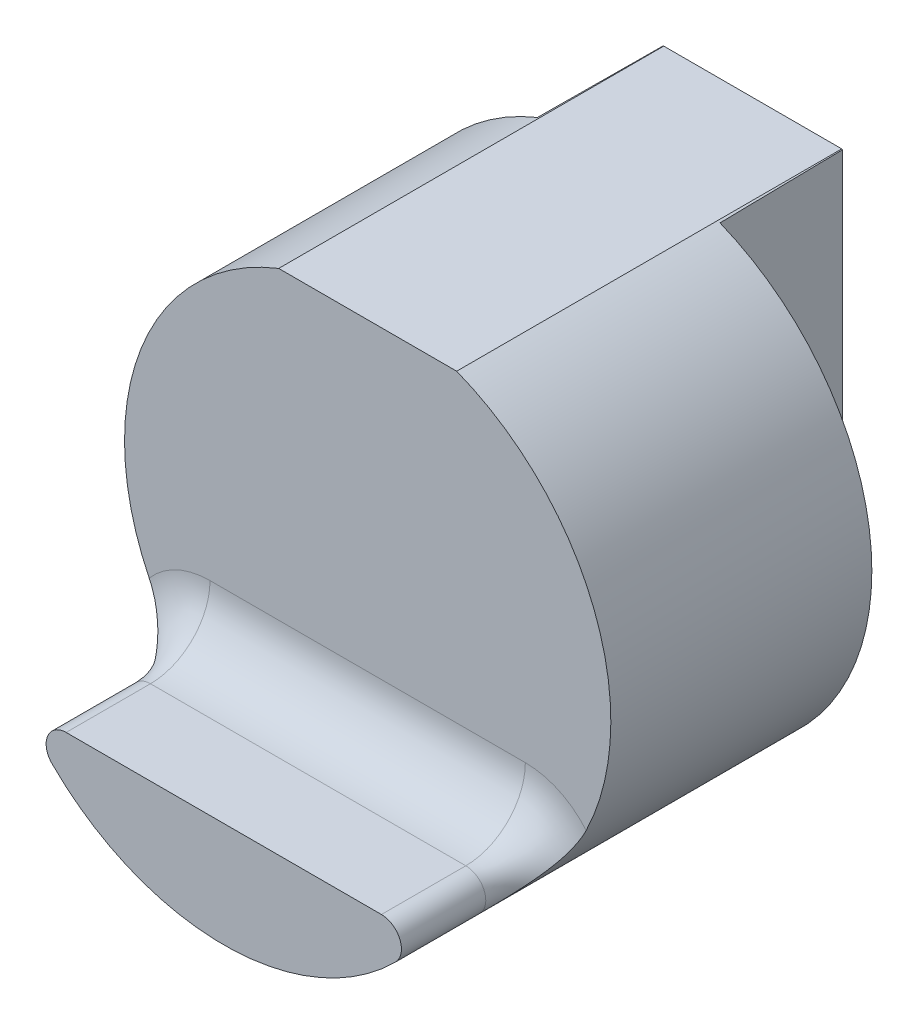
ISO-10303-21;
HEADER;
FILE_DESCRIPTION(('STEP AP214'),'2;1');
FILE_NAME('part.step','',(''),(''),'','','');
FILE_SCHEMA(('AUTOMOTIVE_DESIGN { 1 0 10303 214 1 1 1 1 }'));
ENDSEC;
DATA;
#1=APPLICATION_CONTEXT('core data for automotive mechanical design processes');
#2=APPLICATION_PROTOCOL_DEFINITION('international standard','automotive_design',2000,#1);
#3=PRODUCT_CONTEXT('',#1,'mechanical');
#4=PRODUCT('Part','Part','',(#3));
#5=PRODUCT_RELATED_PRODUCT_CATEGORY('part','',(#4));
#6=PRODUCT_DEFINITION_FORMATION('','',#4);
#7=PRODUCT_DEFINITION_CONTEXT('part definition',#1,'design');
#8=PRODUCT_DEFINITION('design','',#6,#7);
#9=PRODUCT_DEFINITION_SHAPE('','',#8);
#10=(LENGTH_UNIT() NAMED_UNIT(*) SI_UNIT(.MILLI.,.METRE.));
#11=(NAMED_UNIT(*) PLANE_ANGLE_UNIT() SI_UNIT($,.RADIAN.));
#12=(NAMED_UNIT(*) SI_UNIT($,.STERADIAN.) SOLID_ANGLE_UNIT());
#13=UNCERTAINTY_MEASURE_WITH_UNIT(LENGTH_MEASURE(1.E-05),#10,'distance_accuracy_value','');
#14=(GEOMETRIC_REPRESENTATION_CONTEXT(3) GLOBAL_UNCERTAINTY_ASSIGNED_CONTEXT((#13)) GLOBAL_UNIT_ASSIGNED_CONTEXT((#10,
#11,#12)) REPRESENTATION_CONTEXT('',''));
#15=CARTESIAN_POINT('',(0.,0.,0.));
#16=DIRECTION('',(0.,0.,1.));
#17=DIRECTION('',(1.,0.,0.));
#18=AXIS2_PLACEMENT_3D('',#15,#16,#17);
#19=CARTESIAN_POINT('',(7.44185940514708,13.0730877781152,9.8552));
#20=DIRECTION('',(0.,1.,0.));
#21=DIRECTION('',(0.,0.,1.));
#22=AXIS2_PLACEMENT_3D('',#19,#20,#21);
#23=PLANE('',#22);
#24=DIRECTION('',(0.,0.,1.));
#25=VECTOR('',#24,1.);
#26=CARTESIAN_POINT('',(-0.628230806099483,13.0730877781153,9.8552));
#27=LINE('',#26,#25);
#28=CARTESIAN_POINT('',(-0.628230806099473,13.0730877781153,13.5382));
#29=VERTEX_POINT('',#28);
#30=CARTESIAN_POINT('',(-0.62823080609952,13.0730877781153,11.3792));
#31=VERTEX_POINT('',#30);
#32=EDGE_CURVE('E188',#29,#31,#27,.F.);
#33=ORIENTED_EDGE('',*,*,#32,.F.);
#34=DIRECTION('',(1.,0.,0.));
#35=VECTOR('',#34,1.);
#36=CARTESIAN_POINT('',(8.1807441310957,13.0730877781152,13.5382));
#37=LINE('',#36,#35);
#38=CARTESIAN_POINT('',(7.44185940514708,13.0730877781152,13.5382));
#39=VERTEX_POINT('',#38);
#40=EDGE_CURVE('E185',#39,#29,#37,.F.);
#41=ORIENTED_EDGE('',*,*,#40,.F.);
#42=DIRECTION('',(0.,0.,1.));
#43=VECTOR('',#42,1.);
#44=CARTESIAN_POINT('',(7.44185940514708,13.0730877781153,9.8552));
#45=LINE('',#44,#43);
#46=CARTESIAN_POINT('',(7.44185940514708,13.0730877781153,11.3792));
#47=VERTEX_POINT('',#46);
#48=EDGE_CURVE('E193',#47,#39,#45,.T.);
#49=ORIENTED_EDGE('',*,*,#48,.F.);
#50=DIRECTION('',(1.,0.,0.));
#51=VECTOR('',#50,1.);
#52=CARTESIAN_POINT('',(-0.628230806099528,13.0730877781153,11.3792));
#53=LINE('',#52,#51);
#54=EDGE_CURVE('E244',#47,#31,#53,.F.);
#55=ORIENTED_EDGE('',*,*,#54,.T.);
#56=EDGE_LOOP('',(#33,#41,#49,#55));
#57=FACE_BOUND('',#56,.T.);
#58=ADVANCED_FACE('F14',(#57),#23,.T.);
#59=CARTESIAN_POINT('',(-0.628230806099528,14.5970877781153,11.3792));
#60=DIRECTION('',(1.,0.,0.));
#61=DIRECTION('',(0.,0.,-1.));
#62=AXIS2_PLACEMENT_3D('',#59,#60,#61);
#63=CYLINDRICAL_SURFACE('',#62,1.524);
#64=CARTESIAN_POINT('',(-0.628230806099533,14.5970877781153,11.3792));
#65=DIRECTION('',(1.,0.,0.));
#66=DIRECTION('',(0.,1.,0.));
#67=AXIS2_PLACEMENT_3D('',#64,#65,#66);
#68=CIRCLE('',#67,1.52399999999998);
#69=CARTESIAN_POINT('',(-0.628230806099532,14.5970877781153,9.85520000000001));
#70=VERTEX_POINT('',#69);
#71=EDGE_CURVE('E182',#70,#31,#68,.F.);
#72=ORIENTED_EDGE('',*,*,#71,.T.);
#73=ORIENTED_EDGE('',*,*,#54,.F.);
#74=CARTESIAN_POINT('',(7.44185940514708,14.5970877781152,11.3792));
#75=DIRECTION('',(1.,0.,0.));
#76=DIRECTION('',(0.,1.,0.));
#77=AXIS2_PLACEMENT_3D('',#74,#75,#76);
#78=CIRCLE('',#77,1.52400000000001);
#79=CARTESIAN_POINT('',(7.44185940514708,14.5970877781151,9.85520000000001));
#80=VERTEX_POINT('',#79);
#81=EDGE_CURVE('E194',#47,#80,#78,.T.);
#82=ORIENTED_EDGE('',*,*,#81,.T.);
#83=DIRECTION('',(1.,0.,0.));
#84=VECTOR('',#83,1.);
#85=CARTESIAN_POINT('',(9.9409632384777,14.5970877781153,9.8552));
#86=LINE('',#85,#84);
#87=EDGE_CURVE('E181',#70,#80,#86,.T.);
#88=ORIENTED_EDGE('',*,*,#87,.F.);
#89=EDGE_LOOP('',(#72,#73,#82,#88));
#90=FACE_BOUND('',#89,.T.);
#91=ADVANCED_FACE('F343',(#90),#63,.F.);
#92=CARTESIAN_POINT('',(1.07001429952392,23.371277808622,3.175));
#93=DIRECTION('',(0.,0.,1.));
#94=DIRECTION('',(1.,0.,0.));
#95=AXIS2_PLACEMENT_3D('',#92,#93,#94);
#96=PLANE('',#95);
#97=DIRECTION('',(0.,1.,0.));
#98=VECTOR('',#97,1.);
#99=CARTESIAN_POINT('',(1.07001429952392,23.3865683155298,3.175));
#100=LINE('',#99,#98);
#101=CARTESIAN_POINT('',(1.07001429952391,22.371277808622,3.175));
#102=VERTEX_POINT('',#101);
#103=CARTESIAN_POINT('',(1.07001429952378,10.8360977476086,3.175));
#104=VERTEX_POINT('',#103);
#105=EDGE_CURVE('E279',#102,#104,#100,.F.);
#106=ORIENTED_EDGE('',*,*,#105,.T.);
#107=CARTESIAN_POINT('',(3.40681429952383,16.6036877781153,3.175));
#108=DIRECTION('',(0.,0.,1.));
#109=DIRECTION('',(1.,0.,0.));
#110=AXIS2_PLACEMENT_3D('',#107,#108,#109);
#111=CIRCLE('',#110,6.22299999999999);
#112=EDGE_CURVE('E281',#102,#104,#111,.T.);
#113=ORIENTED_EDGE('',*,*,#112,.F.);
#114=EDGE_LOOP('',(#106,#113));
#115=FACE_BOUND('',#114,.T.);
#116=ADVANCED_FACE('F367',(#115),#96,.F.);
#117=CARTESIAN_POINT('',(0.108114299523775,22.6952433586121,0.));
#118=DIRECTION('',(0.,0.,-1.));
#119=DIRECTION('',(-1.,0.,0.));
#120=AXIS2_PLACEMENT_3D('',#117,#118,#119);
#121=PLANE('',#120);
#122=CARTESIAN_POINT('',(3.40681429952383,16.6036877781153,0.));
#123=DIRECTION('',(0.,0.,-1.));
#124=DIRECTION('',(-1.,0.,0.));
#125=AXIS2_PLACEMENT_3D('',#122,#123,#124);
#126=CIRCLE('',#125,6.22299999999999);
#127=CARTESIAN_POINT('',(5.68447352776682,22.3948877781152,0.));
#128=VERTEX_POINT('',#127);
#129=CARTESIAN_POINT('',(5.70551429952296,22.3865683155295,-3.9150429651906E-11));
#130=VERTEX_POINT('',#129);
#131=EDGE_CURVE('E316',#128,#130,#126,.T.);
#132=ORIENTED_EDGE('',*,*,#131,.T.);
#133=DIRECTION('',(0.,1.,0.));
#134=VECTOR('',#133,1.);
#135=CARTESIAN_POINT('',(5.70551429952297,23.3865683155297,-7.83002135351651E-11));
#136=LINE('',#135,#134);
#137=CARTESIAN_POINT('',(5.70551429952283,10.820807240701,-3.91488680812539E-11));
#138=VERTEX_POINT('',#137);
#139=EDGE_CURVE('E317',#130,#138,#136,.F.);
#140=ORIENTED_EDGE('',*,*,#139,.T.);
#141=CARTESIAN_POINT('',(3.40681429952383,16.6036877781153,0.));
#142=DIRECTION('',(0.,0.,1.));
#143=DIRECTION('',(1.,0.,0.));
#144=AXIS2_PLACEMENT_3D('',#141,#142,#143);
#145=CIRCLE('',#144,6.22299999999999);
#146=CARTESIAN_POINT('',(1.10811429952375,10.8208072407015,1.01325033446495E-12));
#147=VERTEX_POINT('',#146);
#148=EDGE_CURVE('E305',#147,#138,#145,.T.);
#149=ORIENTED_EDGE('',*,*,#148,.F.);
#150=DIRECTION('',(0.,1.,0.));
#151=VECTOR('',#150,1.);
#152=CARTESIAN_POINT('',(1.1081142995239,23.3865683155298,2.02897594558937E-12));
#153=LINE('',#152,#151);
#154=CARTESIAN_POINT('',(1.1081142995239,22.3865683155292,1.014420521571E-12));
#155=VERTEX_POINT('',#154);
#156=EDGE_CURVE('E282',#147,#155,#153,.T.);
#157=ORIENTED_EDGE('',*,*,#156,.T.);
#158=CARTESIAN_POINT('',(3.40681429952383,16.6036877781153,0.));
#159=DIRECTION('',(0.,0.,-1.));
#160=DIRECTION('',(-1.,0.,0.));
#161=AXIS2_PLACEMENT_3D('',#158,#159,#160);
#162=CIRCLE('',#161,6.22299999999999);
#163=CARTESIAN_POINT('',(1.12915507128087,22.3948877781152,0.));
#164=VERTEX_POINT('',#163);
#165=EDGE_CURVE('E17',#155,#164,#162,.T.);
#166=ORIENTED_EDGE('',*,*,#165,.T.);
#167=DIRECTION('',(1.,0.,0.));
#168=VECTOR('',#167,1.);
#169=CARTESIAN_POINT('',(5.68447352776686,22.3948877781152,0.));
#170=LINE('',#169,#168);
#171=EDGE_CURVE('E324',#128,#164,#170,.F.);
#172=ORIENTED_EDGE('',*,*,#171,.F.);
#173=EDGE_LOOP('',(#132,#140,#149,#157,#166,#172));
#174=FACE_BOUND('',#173,.T.);
#175=ADVANCED_FACE('F323',(#174),#121,.T.);
#176=CARTESIAN_POINT('',(10.629814299524,23.3712778086219,3.175));
#177=DIRECTION('',(0.,0.,1.));
#178=DIRECTION('',(1.,0.,0.));
#179=AXIS2_PLACEMENT_3D('',#176,#177,#178);
#180=PLANE('',#179);
#181=DIRECTION('',(0.,1.,0.));
#182=VECTOR('',#181,1.);
#183=CARTESIAN_POINT('',(5.74361429952392,23.3865683155297,3.175));
#184=LINE('',#183,#182);
#185=CARTESIAN_POINT('',(5.74361429952377,10.8360977476086,3.175));
#186=VERTEX_POINT('',#185);
#187=CARTESIAN_POINT('',(5.74361429952391,22.3712778086219,3.175));
#188=VERTEX_POINT('',#187);
#189=EDGE_CURVE('E236',#186,#188,#184,.T.);
#190=ORIENTED_EDGE('',*,*,#189,.T.);
#191=CARTESIAN_POINT('',(3.40681429952383,16.6036877781153,3.175));
#192=DIRECTION('',(0.,0.,1.));
#193=DIRECTION('',(1.,0.,0.));
#194=AXIS2_PLACEMENT_3D('',#191,#192,#193);
#195=CIRCLE('',#194,6.22299999999999);
#196=EDGE_CURVE('E299',#186,#188,#195,.T.);
#197=ORIENTED_EDGE('',*,*,#196,.F.);
#198=EDGE_LOOP('',(#190,#197));
#199=FACE_BOUND('',#198,.T.);
#200=ADVANCED_FACE('F374',(#199),#180,.F.);
#201=CARTESIAN_POINT('',(5.74361429952392,23.3865683155297,3.175));
#202=DIRECTION('',(-0.999928007775067,0.,0.011999136093302));
#203=DIRECTION('',(0.011999136093302,0.,0.999928007775067));
#204=AXIS2_PLACEMENT_3D('',#201,#202,#203);
#205=PLANE('',#204);
#206=ORIENTED_EDGE('',*,*,#189,.F.);
#207=CARTESIAN_POINT('',(3.40681429952383,16.6036877781153,-191.558333333315));
#208=DIRECTION('',(-0.999928007775067,0.,0.011999136093302));
#209=DIRECTION('',(0.011999136093302,0.,0.999928007775067));
#210=AXIS2_PLACEMENT_3D('',#207,#208,#209);
#211=ELLIPSE('',#210,518.620669989209,6.22299999999999);
#212=EDGE_CURVE('E302',#138,#186,#211,.T.);
#213=ORIENTED_EDGE('',*,*,#212,.F.);
#214=ORIENTED_EDGE('',*,*,#139,.F.);
#215=CARTESIAN_POINT('',(3.40681429952383,16.6036877781153,-191.558333333315));
#216=DIRECTION('',(-0.999928007775067,0.,0.011999136093302));
#217=DIRECTION('',(0.011999136093302,0.,0.999928007775067));
#218=AXIS2_PLACEMENT_3D('',#215,#216,#217);
#219=ELLIPSE('',#218,518.620669989209,6.22299999999999);
#220=EDGE_CURVE('E293',#188,#130,#219,.T.);
#221=ORIENTED_EDGE('',*,*,#220,.F.);
#222=EDGE_LOOP('',(#206,#213,#214,#221));
#223=FACE_BOUND('',#222,.T.);
#224=ADVANCED_FACE('F221',(#223),#205,.F.);
#225=CARTESIAN_POINT('',(7.44185940514708,12.5615328837385,11.3792));
#226=DIRECTION('',(0.,0.,-1.));
#227=DIRECTION('',(-1.,0.,0.));
#228=AXIS2_PLACEMENT_3D('',#225,#226,#227);
#229=TOROIDAL_SURFACE('',#228,2.03555489437672,1.52400000000001);
#230=ORIENTED_EDGE('',*,*,#81,.F.);
#231=CARTESIAN_POINT('',(7.44185940514708,12.5615328837385,11.3792));
#232=DIRECTION('',(0.,0.,1.));
#233=DIRECTION('',(1.,0.,0.));
#234=AXIS2_PLACEMENT_3D('',#231,#232,#233);
#235=CIRCLE('',#234,0.511554894376721);
#236=CARTESIAN_POINT('',(7.80326479755485,12.1994906868894,11.3792));
#237=VERTEX_POINT('',#236);
#238=EDGE_CURVE('E190',#237,#47,#235,.T.);
#239=ORIENTED_EDGE('',*,*,#238,.F.);
#240=CARTESIAN_POINT('',(7.80326479722472,12.1994906865598,11.3792));
#241=CARTESIAN_POINT('',(7.81974624997856,12.216020406333,11.3414741406336));
#242=CARTESIAN_POINT('',(7.83594323329729,12.2323942105927,11.3035554522183));
#243=CARTESIAN_POINT('',(7.86856036999129,12.2656882393654,11.226903893011));
#244=CARTESIAN_POINT('',(7.8849775527536,12.282612545547,11.1881715344949));
#245=CARTESIAN_POINT('',(7.91000615561975,12.3087030558736,11.130051250599));
#246=CARTESIAN_POINT('',(7.91849673755769,12.3176030517468,11.1104929481932));
#247=CARTESIAN_POINT('',(7.9357723405555,12.3358421711624,11.0710327653903));
#248=CARTESIAN_POINT('',(7.94455945690875,12.3451867113671,11.0511343176507));
#249=CARTESIAN_POINT('',(7.97047160408612,12.3729021931812,10.9930100498647));
#250=CARTESIAN_POINT('',(7.98773568527975,12.3915696987409,10.9549854881653));
#251=CARTESIAN_POINT('',(8.02196261367553,12.429127784886,10.8815173616286));
#252=CARTESIAN_POINT('',(8.03890157876769,12.4479667885027,10.8460364139883));
#253=CARTESIAN_POINT('',(8.0731917145324,12.4865066660436,10.7762369451211));
#254=CARTESIAN_POINT('',(8.09053782007492,12.5061982852771,10.7419108482927));
#255=CARTESIAN_POINT('',(8.12621619828457,12.5472098983489,10.6736532774443));
#256=CARTESIAN_POINT('',(8.14456119502264,12.5685544093648,10.6397430643701));
#257=CARTESIAN_POINT('',(8.18228212051384,12.6131577538098,10.5726113628434));
#258=CARTESIAN_POINT('',(8.20167127353489,12.636446136223,10.5394168305882));
#259=CARTESIAN_POINT('',(8.2414874441966,12.6851307271864,10.4740262734745));
#260=CARTESIAN_POINT('',(8.26192724579391,12.7105588399042,10.4418616922775));
#261=CARTESIAN_POINT('',(8.30383217672058,12.7636298728412,10.3788641971806));
#262=CARTESIAN_POINT('',(8.32530915225955,12.7913044784978,10.3480657851562));
#263=CARTESIAN_POINT('',(8.36625219648506,12.8448843663271,10.2922964375033));
#264=CARTESIAN_POINT('',(8.38564023667833,12.8705879012981,10.2670749095703));
#265=CARTESIAN_POINT('',(8.41539970605815,12.910679497659,10.2301811203145));
#266=CARTESIAN_POINT('',(8.42561943380744,12.924559253954,10.2178303371881));
#267=CARTESIAN_POINT('',(8.44640222548006,12.9530356205401,10.1933584340239));
#268=CARTESIAN_POINT('',(8.45696763302071,12.9676414439101,10.1812499949959));
#269=CARTESIAN_POINT('',(8.47843162367479,12.9975970644286,10.1573243975637));
#270=CARTESIAN_POINT('',(8.48933219371427,13.0129562816506,10.1455208129168));
#271=CARTESIAN_POINT('',(8.51145393525188,13.04444267821,10.1222688019893));
#272=CARTESIAN_POINT('',(8.52267671020693,13.0605793969916,10.1108348081704));
#273=CARTESIAN_POINT('',(8.54542771745121,13.0936405478799,10.0883889109687));
#274=CARTESIAN_POINT('',(8.55695714357645,13.1105745335247,10.0773922809842));
#275=CARTESIAN_POINT('',(8.58030412790251,13.1452453005685,10.0558906763448));
#276=CARTESIAN_POINT('',(8.59212245702947,13.1629915441336,10.045401785767));
#277=CARTESIAN_POINT('',(8.61602711265791,13.1992970746141,10.0249879559642));
#278=CARTESIAN_POINT('',(8.628113763787,13.21786563318,10.0150798810976));
#279=CARTESIAN_POINT('',(8.65253519751439,13.2558192634839,9.99590174531102));
#280=CARTESIAN_POINT('',(8.66486990370081,13.2752132866218,9.98664927621445));
#281=CARTESIAN_POINT('',(8.68739466798771,13.3110605036619,9.97054919298471));
#282=CARTESIAN_POINT('',(8.69758977089228,13.3274476797255,9.96356127143002));
#283=CARTESIAN_POINT('',(8.71816125471026,13.3608687718912,9.95006487765183));
#284=CARTESIAN_POINT('',(8.72853665081579,13.3779089739038,9.94357044831781));
#285=CARTESIAN_POINT('',(8.74944929973656,13.412638189258,9.93111499281024));
#286=CARTESIAN_POINT('',(8.75998519015532,13.4303332611797,9.92516856857));
#287=CARTESIAN_POINT('',(8.781195914134,13.4663722456218,9.91386462431994));
#288=CARTESIAN_POINT('',(8.79186896271205,13.4847219622269,9.90852224886299));
#289=CARTESIAN_POINT('',(8.81332972924328,13.5220659698976,9.89848294105576));
#290=CARTESIAN_POINT('',(8.82411524378669,13.5410657396559,9.89380166851786));
#291=CARTESIAN_POINT('',(8.84577478117772,13.5797015509344,9.8851420331347));
#292=CARTESIAN_POINT('',(8.85664617651503,13.599342686985,9.88117981631144));
#293=CARTESIAN_POINT('',(8.87844964161491,13.6392484707713,9.87401644468844));
#294=CARTESIAN_POINT('',(8.88937866008323,13.6595177678282,9.87083188898221));
#295=CARTESIAN_POINT('',(8.9112679148435,13.7006624047365,9.86528239429513));
#296=CARTESIAN_POINT('',(8.92222467861286,13.7215418892615,9.86293446996547));
#297=CARTESIAN_POINT('',(8.94413834432205,13.7638845548041,9.85911705670462));
#298=CARTESIAN_POINT('',(8.95509135616351,13.7853513197873,9.85766495942278));
#299=CARTESIAN_POINT('',(8.97696525608687,13.8288407083551,9.85569742091947));
#300=CARTESIAN_POINT('',(8.9878818492718,13.8508662943326,9.85519969570634));
#301=CARTESIAN_POINT('',(8.99866830757968,13.872955687157,9.85520000000001));
#302=B_SPLINE_CURVE_WITH_KNOTS('',3,(#240,#241,#242,#243,#244,#245,#246,#247,#248,#249,#250,
#251,#252,#253,#254,#255,#256,#257,#258,#259,#260,#261,#262,#263,#264,#265,#266,#267,#268,#269,
#270,#271,#272,#273,#274,#275,#276,#277,#278,#279,#280,#281,#282,#283,#284,#285,#286,#287,#288,
#289,#290,#291,#292,#293,#294,#295,#296,#297,#298,#299,#300,#301),.UNSPECIFIED.,.F.,.F.,(4,2,2,
2,2,2,2,2,2,2,2,2,2,2,2,2,2,2,2,2,2,2,2,2,2,2,2,2,2,2,4),(0.,0.13309238621414,0.269123925798191,
0.338436082476292,0.409458768825228,0.546667406485324,0.677437240229422,0.807033206455985,
0.939194449449225,1.07397412991016,1.21134368383226,1.35119198554106,1.47381995127455,
1.53742500740784,1.60256083728866,1.66923051980606,1.73743506868615,1.80717333896086,
1.87844193759103,1.95123514289084,2.02554483773195,2.08711145723688,2.15004136028929,
2.2143344426732,2.27998956150107,2.3470044977477,2.41537592225796,2.48509936670341,
2.55616920100413,2.62857861875636,2.70231963221103),.UNSPECIFIED.);
#303=CARTESIAN_POINT('',(8.99866830757972,13.872955687157,9.8552));
#304=VERTEX_POINT('',#303);
#305=EDGE_CURVE('E202',#304,#237,#302,.F.);
#306=ORIENTED_EDGE('',*,*,#305,.F.);
#307=CARTESIAN_POINT('',(7.44185940514708,12.5615328837385,9.85520000000001));
#308=DIRECTION('',(0.,0.,1.));
#309=DIRECTION('',(0.764808115336823,0.644258136708367,0.));
#310=AXIS2_PLACEMENT_3D('',#307,#308,#309);
#311=CIRCLE('',#310,2.03555489437667);
#312=EDGE_CURVE('E258',#80,#304,#311,.F.);
#313=ORIENTED_EDGE('',*,*,#312,.F.);
#314=EDGE_LOOP('',(#230,#239,#306,#313));
#315=FACE_BOUND('',#314,.T.);
#316=ADVANCED_FACE('F210',(#315),#229,.F.);
#317=CARTESIAN_POINT('',(7.44185940514708,12.5615328837385,9.8552));
#318=DIRECTION('',(0.,0.,1.));
#319=DIRECTION('',(1.,0.,0.));
#320=AXIS2_PLACEMENT_3D('',#317,#318,#319);
#321=CYLINDRICAL_SURFACE('',#320,0.511554894376721);
#322=CARTESIAN_POINT('',(7.44185940514708,12.5615328837385,13.5382));
#323=DIRECTION('',(0.,0.,1.));
#324=DIRECTION('',(1.,0.,0.));
#325=AXIS2_PLACEMENT_3D('',#322,#323,#324);
#326=CIRCLE('',#325,0.511554894376721);
#327=CARTESIAN_POINT('',(7.80326479854528,12.1994906878781,13.5382));
#328=VERTEX_POINT('',#327);
#329=EDGE_CURVE('E189',#328,#39,#326,.T.);
#330=ORIENTED_EDGE('',*,*,#329,.F.);
#331=DIRECTION('',(0.,0.,1.));
#332=VECTOR('',#331,1.);
#333=CARTESIAN_POINT('',(7.80326479722469,12.1994906865598,-0.100000000000006));
#334=LINE('',#333,#332);
#335=EDGE_CURVE('E286',#237,#328,#334,.T.);
#336=ORIENTED_EDGE('',*,*,#335,.F.);
#337=ORIENTED_EDGE('',*,*,#238,.T.);
#338=ORIENTED_EDGE('',*,*,#48,.T.);
#339=EDGE_LOOP('',(#330,#336,#337,#338));
#340=FACE_BOUND('',#339,.T.);
#341=ADVANCED_FACE('F220',(#340),#321,.T.);
#342=CARTESIAN_POINT('',(8.1807441310957,13.1403976120055,13.5382));
#343=DIRECTION('',(0.,0.,1.));
#344=DIRECTION('',(1.,0.,0.));
#345=AXIS2_PLACEMENT_3D('',#342,#343,#344);
#346=PLANE('',#345);
#347=CARTESIAN_POINT('',(-0.628230806099463,12.5615328837386,13.5382));
#348=DIRECTION('',(0.,0.,1.));
#349=DIRECTION('',(1.,0.,0.));
#350=AXIS2_PLACEMENT_3D('',#347,#348,#349);
#351=CIRCLE('',#350,0.511554894376736);
#352=CARTESIAN_POINT('',(-0.989636202480878,12.1994906908561,13.5382));
#353=VERTEX_POINT('',#352);
#354=EDGE_CURVE('E241',#353,#29,#351,.F.);
#355=ORIENTED_EDGE('',*,*,#354,.F.);
#356=CARTESIAN_POINT('',(3.40681429952383,16.6036877781153,13.5382));
#357=DIRECTION('',(0.,0.,1.));
#358=DIRECTION('',(1.,0.,0.));
#359=AXIS2_PLACEMENT_3D('',#356,#357,#358);
#360=CIRCLE('',#359,6.22299999999999);
#361=EDGE_CURVE('E152',#328,#353,#360,.F.);
#362=ORIENTED_EDGE('',*,*,#361,.F.);
#363=ORIENTED_EDGE('',*,*,#329,.T.);
#364=ORIENTED_EDGE('',*,*,#40,.T.);
#365=EDGE_LOOP('',(#355,#362,#363,#364));
#366=FACE_BOUND('',#365,.T.);
#367=ADVANCED_FACE('F350',(#366),#346,.T.);
#368=CARTESIAN_POINT('',(-0.628230806099463,12.5615328837386,9.8552));
#369=DIRECTION('',(0.,0.,1.));
#370=DIRECTION('',(1.,0.,0.));
#371=AXIS2_PLACEMENT_3D('',#368,#369,#370);
#372=CYLINDRICAL_SURFACE('',#371,0.511554894376736);
#373=DIRECTION('',(0.,0.,1.));
#374=VECTOR('',#373,1.);
#375=CARTESIAN_POINT('',(-0.989636204143501,12.1994906925158,-0.100000000000006));
#376=LINE('',#375,#374);
#377=CARTESIAN_POINT('',(-0.989636205034007,12.1994906934047,11.3791999979195));
#378=VERTEX_POINT('',#377);
#379=EDGE_CURVE('E121',#353,#378,#376,.F.);
#380=ORIENTED_EDGE('',*,*,#379,.F.);
#381=ORIENTED_EDGE('',*,*,#354,.T.);
#382=ORIENTED_EDGE('',*,*,#32,.T.);
#383=CARTESIAN_POINT('',(-0.628230806099539,12.5615328837386,11.3792));
#384=DIRECTION('',(0.,0.,-1.));
#385=DIRECTION('',(-1.,0.,0.));
#386=AXIS2_PLACEMENT_3D('',#383,#384,#385);
#387=CIRCLE('',#386,0.511554894376687);
#388=EDGE_CURVE('E174',#31,#378,#387,.F.);
#389=ORIENTED_EDGE('',*,*,#388,.T.);
#390=EDGE_LOOP('',(#380,#381,#382,#389));
#391=FACE_BOUND('',#390,.T.);
#392=ADVANCED_FACE('F160',(#391),#372,.T.);
#393=CARTESIAN_POINT('',(-0.628230806099539,12.5615328837386,11.3792));
#394=DIRECTION('',(0.,0.,-1.));
#395=DIRECTION('',(-1.,0.,0.));
#396=AXIS2_PLACEMENT_3D('',#393,#394,#395);
#397=TOROIDAL_SURFACE('',#396,2.03555489437667,1.52399999999998);
#398=CARTESIAN_POINT('',(-1.32464560307133,12.5615328837386,10.6516838149413));
#399=CARTESIAN_POINT('',(-1.32039928612483,12.5565623456803,10.6595000520638));
#400=CARTESIAN_POINT('',(-1.31617102545665,12.5516265543448,10.6673481731126));
#401=CARTESIAN_POINT('',(-1.30773050662963,12.541802041251,10.6831421670036));
#402=CARTESIAN_POINT('',(-1.30351840863926,12.5369136355412,10.6910883220543));
#403=CARTESIAN_POINT('',(-1.29511008021934,12.5271851225923,10.7070766679597));
#404=CARTESIAN_POINT('',(-1.29091400323315,12.5223453260903,10.715119128545));
#405=CARTESIAN_POINT('',(-1.28253765653913,12.5127146925041,10.7312982761528));
#406=CARTESIAN_POINT('',(-1.27835753475533,12.5079241595603,10.7394352207664));
#407=CARTESIAN_POINT('',(-1.27001302292698,12.4983922663128,10.7558014649684));
#408=CARTESIAN_POINT('',(-1.26584877605888,12.4936512029472,10.7640310104573));
#409=CARTESIAN_POINT('',(-1.25753589759435,12.4842179748569,10.7805805140797));
#410=CARTESIAN_POINT('',(-1.25338740506894,12.4795260991907,10.7889007067896));
#411=CARTESIAN_POINT('',(-1.24510583095056,12.4701904923649,10.8056294937621));
#412=CARTESIAN_POINT('',(-1.24097288475512,12.4655470418016,10.8140383115947));
#413=CARTESIAN_POINT('',(-1.23272206607369,12.4563070493251,10.8309422681476));
#414=CARTESIAN_POINT('',(-1.22860432554935,12.4517107789814,10.8394376196723));
#415=CARTESIAN_POINT('',(-1.220383399019,12.4425634349414,10.8565124935901));
#416=CARTESIAN_POINT('',(-1.21628034156634,12.4380126232322,10.8650922181746));
#417=CARTESIAN_POINT('',(-1.20808802851266,12.4289540157704,10.8823336181792));
#418=CARTESIAN_POINT('',(-1.20399889785909,12.4244464718449,10.8909954852212));
#419=CARTESIAN_POINT('',(-1.19583339901339,12.4154717676713,10.9083988822545));
#420=CARTESIAN_POINT('',(-1.19175715172048,12.4110048484921,10.917140593227));
#421=CARTESIAN_POINT('',(-1.1836160355893,12.4021083133892,10.9347013144185));
#422=CARTESIAN_POINT('',(-1.17955128287555,12.3976789270663,10.9435204947313));
#423=CARTESIAN_POINT('',(-1.17143137754464,12.3888540073992,10.9612337453595));
#424=CARTESIAN_POINT('',(-1.16737633527175,12.3844586916422,10.9701279745983));
#425=CARTESIAN_POINT('',(-1.15927359005724,12.3756979160978,10.9879887552713));
#426=CARTESIAN_POINT('',(-1.15522599019761,12.3713326604091,10.9969554535201));
#427=CARTESIAN_POINT('',(-1.14755280007656,12.3630772994031,11.0140301381169));
#428=CARTESIAN_POINT('',(-1.14392514123016,12.3591829789358,11.0221351580887));
#429=CARTESIAN_POINT('',(-1.1365891422097,12.3513268588457,11.0385884457874));
#430=CARTESIAN_POINT('',(-1.13288125558763,12.3473660606002,11.0469373939091));
#431=CARTESIAN_POINT('',(-1.12538502750867,12.3393792417598,11.0638785471704));
#432=CARTESIAN_POINT('',(-1.12159711341349,12.3353542187281,11.0724714115755));
#433=CARTESIAN_POINT('',(-1.11394062028693,12.3272403222087,11.0899001838906));
#434=CARTESIAN_POINT('',(-1.11007243700541,12.3231524247457,11.0987367198987));
#435=CARTESIAN_POINT('',(-1.10225457094906,12.3149130198235,11.1166522571015));
#436=CARTESIAN_POINT('',(-1.098305243039,12.3107624452292,11.125731841994));
#437=CARTESIAN_POINT('',(-1.09032348398604,12.3023968802597,11.1441325759954));
#438=CARTESIAN_POINT('',(-1.08629135512319,12.2981827623889,11.1534542526856));
#439=CARTESIAN_POINT('',(-1.07814132133393,12.2896880104532,11.1723377662833));
#440=CARTESIAN_POINT('',(-1.07402364844988,12.285408167145,11.181900058849));
#441=CARTESIAN_POINT('',(-1.06638782828376,12.2774935101015,11.1996611106576));
#442=CARTESIAN_POINT('',(-1.06286883048189,12.2738546562436,11.2078577047542));
#443=CARTESIAN_POINT('',(-1.05558919338536,12.2663460101256,11.224835606934));
#444=CARTESIAN_POINT('',(-1.05182884738187,12.262477843842,11.2336177599142));
#445=CARTESIAN_POINT('',(-1.04406558192567,12.2545134087506,11.2517670566612));
#446=CARTESIAN_POINT('',(-1.04006284660439,12.2504187275999,11.261134975671));
#447=CARTESIAN_POINT('',(-1.03396661969449,12.2442000010799,11.2754096747809));
#448=CARTESIAN_POINT('',(-1.03187319008072,12.242067654474,11.2803128678431));
#449=CARTESIAN_POINT('',(-1.02804872094465,12.2381777978246,11.2892712154971));
#450=CARTESIAN_POINT('',(-1.02631777503904,12.2364193932833,11.2933260216531));
#451=CARTESIAN_POINT('',(-1.01963521732474,12.2296391876067,11.3089815278438));
#452=CARTESIAN_POINT('',(-1.01468229579889,12.2246316073811,11.32058783026));
#453=CARTESIAN_POINT('',(-1.00638119098193,12.2162679406384,11.3400299605396));
#454=CARTESIAN_POINT('',(-1.00303529598519,12.2129047155278,11.3478636973256));
#455=CARTESIAN_POINT('',(-0.998013033375621,12.207868144212,11.3596153090474));
#456=CARTESIAN_POINT('',(-0.996338544115085,12.2061908328237,11.3635322873855));
#457=CARTESIAN_POINT('',(-0.992988371508747,12.2028388751359,11.3713661323822));
#458=CARTESIAN_POINT('',(-0.991312688360541,12.2011642284994,11.3752829989809));
#459=CARTESIAN_POINT('',(-0.989636205034016,12.1994906934047,11.3791999979195));
#460=B_SPLINE_CURVE_WITH_KNOTS('',3,(#398,#399,#400,#401,#402,#403,#404,#405,#406,#407,#408,
#409,#410,#411,#412,#413,#414,#415,#416,#417,#418,#419,#420,#421,#422,#423,#424,#425,#426,#427,
#428,#429,#430,#431,#432,#433,#434,#435,#436,#437,#438,#439,#440,#441,#442,#443,#444,#445,#446,
#447,#448,#449,#450,#451,#452,#453,#454,#455,#456,#457,#458,#459),.UNSPECIFIED.,.F.,.F.,(4,2,2,
2,2,2,2,2,2,2,2,2,2,2,2,2,2,2,2,2,2,2,2,2,2,2,2,2,2,2,4),(0.,0.03056910282819,
0.0612771948921895,0.0921216053829732,0.123100048739229,0.154210641224086,0.185451916379289,
0.216822839539906,0.24832282159567,0.27995173218852,0.311709912539516,0.34359818810192,
0.375617881240506,0.407770824139623,0.4400593721444,0.469147967352808,0.499018758444107,
0.529669542432339,0.561099083516469,0.593307211995529,0.626294924394473,0.660064485852457,
0.688965644705822,0.71988585932299,0.7528238846644,0.770049904898605,0.784289514245349,
0.825018107790994,0.852492881594812,0.866227510782533,0.879960236955478),.UNSPECIFIED.);
#461=CARTESIAN_POINT('',(-1.32464560307133,12.5615328837386,10.6516838149413));
#462=VERTEX_POINT('',#461);
#463=EDGE_CURVE('E106',#378,#462,#460,.F.);
#464=ORIENTED_EDGE('',*,*,#463,.F.);
#465=ORIENTED_EDGE('',*,*,#388,.F.);
#466=ORIENTED_EDGE('',*,*,#71,.F.);
#467=CARTESIAN_POINT('',(-0.628230806099539,12.5615328837386,9.85520000000001));
#468=DIRECTION('',(0.,0.,1.));
#469=DIRECTION('',(0.,1.,0.));
#470=AXIS2_PLACEMENT_3D('',#467,#468,#469);
#471=CIRCLE('',#470,2.03555489437664);
#472=CARTESIAN_POINT('',(-2.18503970853224,13.8729556871574,9.8552));
#473=VERTEX_POINT('',#472);
#474=EDGE_CURVE('E111',#473,#70,#471,.F.);
#475=ORIENTED_EDGE('',*,*,#474,.F.);
#476=CARTESIAN_POINT('',(-1.32464560307133,12.5615328837385,10.6516838149413));
#477=CARTESIAN_POINT('',(-1.35363874952497,12.5954809430353,10.5982487493101));
#478=CARTESIAN_POINT('',(-1.38352810713594,12.6311971372842,10.5463430223375));
#479=CARTESIAN_POINT('',(-1.4450211655927,12.706532809032,10.4463016173112));
#480=CARTESIAN_POINT('',(-1.47662886022811,12.7461615711372,10.3981754183297));
#481=CARTESIAN_POINT('',(-1.54149222760551,12.8297256609979,10.3064544406864));
#482=CARTESIAN_POINT('',(-1.57475503924679,12.8736806212634,10.2628823615713));
#483=CARTESIAN_POINT('',(-1.64234541895158,12.9656972033573,10.1813936344297));
#484=CARTESIAN_POINT('',(-1.67667176841016,13.0137542283574,10.1434707833495));
#485=CARTESIAN_POINT('',(-1.76242880868161,13.1377525339497,10.0573810225944));
#486=CARTESIAN_POINT('',(-1.81422480462388,13.2160794887708,10.0129284135518));
#487=CARTESIAN_POINT('',(-1.91690798415566,13.3798723409194,9.93991563592036));
#488=CARTESIAN_POINT('',(-1.9677982289327,13.4653041632354,9.91128413370246));
#489=CARTESIAN_POINT('',(-2.04639742203721,13.6050641525261,9.87920666428027));
#490=CARTESIAN_POINT('',(-2.07500444740495,13.6576755282339,9.87024308625284));
#491=CARTESIAN_POINT('',(-2.13102253138234,13.7643645065431,9.85822962244883));
#492=CARTESIAN_POINT('',(-2.15843037825848,13.8184454844682,9.85519476825277));
#493=CARTESIAN_POINT('',(-2.18503970853225,13.8729556871574,9.85520000000001));
#494=B_SPLINE_CURVE_WITH_KNOTS('',3,(#476,#477,#478,#479,#480,#481,#482,#483,#484,#485,#486,
#487,#488,#489,#490,#491,#492,#493),.UNSPECIFIED.,.F.,.F.,(4,2,2,2,2,2,2,2,4),(0.,
0.208938601298207,0.418385513221622,0.628831053000368,0.839043785278554,1.14930204299099,
1.45814976134833,1.63951713017163,1.82134374083521),.UNSPECIFIED.);
#495=EDGE_CURVE('E102',#462,#473,#494,.T.);
#496=ORIENTED_EDGE('',*,*,#495,.F.);
#497=EDGE_LOOP('',(#464,#465,#466,#475,#496));
#498=FACE_BOUND('',#497,.T.);
#499=ADVANCED_FACE('F104',(#498),#397,.F.);
#500=CARTESIAN_POINT('',(9.9409632384777,10.0803337991238,9.8552));
#501=DIRECTION('',(0.,0.,1.));
#502=DIRECTION('',(1.,0.,0.));
#503=AXIS2_PLACEMENT_3D('',#500,#501,#502);
#504=PLANE('',#503);
#505=CARTESIAN_POINT('',(3.40681429952383,16.6036877781153,9.8552));
#506=DIRECTION('',(0.,0.,1.));
#507=DIRECTION('',(1.,0.,0.));
#508=AXIS2_PLACEMENT_3D('',#505,#506,#507);
#509=CIRCLE('',#508,6.22299999999999);
#510=CARTESIAN_POINT('',(1.12915507128087,22.3948877781152,9.8552));
#511=VERTEX_POINT('',#510);
#512=EDGE_CURVE('E115',#473,#511,#509,.F.);
#513=ORIENTED_EDGE('',*,*,#512,.F.);
#514=ORIENTED_EDGE('',*,*,#474,.T.);
#515=ORIENTED_EDGE('',*,*,#87,.T.);
#516=ORIENTED_EDGE('',*,*,#312,.T.);
#517=CARTESIAN_POINT('',(3.40681429952383,16.6036877781153,9.8552));
#518=DIRECTION('',(0.,0.,1.));
#519=DIRECTION('',(1.,0.,0.));
#520=AXIS2_PLACEMENT_3D('',#517,#518,#519);
#521=CIRCLE('',#520,6.22299999999999);
#522=CARTESIAN_POINT('',(5.68447352776682,22.3948877781152,9.8552));
#523=VERTEX_POINT('',#522);
#524=EDGE_CURVE('E290',#523,#304,#521,.F.);
#525=ORIENTED_EDGE('',*,*,#524,.F.);
#526=DIRECTION('',(1.,0.,0.));
#527=VECTOR('',#526,1.);
#528=CARTESIAN_POINT('',(5.68447352776686,22.3948877781152,9.8552));
#529=LINE('',#528,#527);
#530=EDGE_CURVE('E168',#511,#523,#529,.T.);
#531=ORIENTED_EDGE('',*,*,#530,.F.);
#532=EDGE_LOOP('',(#513,#514,#515,#516,#525,#531));
#533=FACE_BOUND('',#532,.T.);
#534=ADVANCED_FACE('F159',(#533),#504,.T.);
#535=CARTESIAN_POINT('',(5.68447352776686,22.3948877781152,0.));
#536=DIRECTION('',(0.,1.,0.));
#537=DIRECTION('',(0.,0.,1.));
#538=AXIS2_PLACEMENT_3D('',#535,#536,#537);
#539=PLANE('',#538);
#540=DIRECTION('',(0.,0.,1.));
#541=VECTOR('',#540,1.);
#542=CARTESIAN_POINT('',(1.1291550712809,22.3948877781153,-0.100000000000006));
#543=LINE('',#542,#541);
#544=EDGE_CURVE('E23',#511,#164,#543,.F.);
#545=ORIENTED_EDGE('',*,*,#544,.F.);
#546=ORIENTED_EDGE('',*,*,#530,.T.);
#547=DIRECTION('',(0.,0.,1.));
#548=VECTOR('',#547,1.);
#549=CARTESIAN_POINT('',(5.68447352776683,22.3948877781152,-0.100000000000006));
#550=LINE('',#549,#548);
#551=EDGE_CURVE('E291',#128,#523,#550,.T.);
#552=ORIENTED_EDGE('',*,*,#551,.F.);
#553=ORIENTED_EDGE('',*,*,#171,.T.);
#554=EDGE_LOOP('',(#545,#546,#552,#553));
#555=FACE_BOUND('',#554,.T.);
#556=ADVANCED_FACE('F329',(#555),#539,.T.);
#557=CARTESIAN_POINT('',(1.1201134356194,23.3865683155298,-0.999928007956393));
#558=DIRECTION('',(0.999928007775067,0.,0.011999136093302));
#559=DIRECTION('',(0.011999136093302,0.,-0.999928007775067));
#560=AXIS2_PLACEMENT_3D('',#557,#558,#559);
#561=PLANE('',#560);
#562=ORIENTED_EDGE('',*,*,#105,.F.);
#563=CARTESIAN_POINT('',(3.40681429952383,16.6036877781153,-191.558333333313));
#564=DIRECTION('',(0.999928007775067,0.,0.011999136093302));
#565=DIRECTION('',(-0.011999136093302,0.,0.999928007775067));
#566=AXIS2_PLACEMENT_3D('',#563,#564,#565);
#567=ELLIPSE('',#566,518.620669989209,6.22299999999999);
#568=EDGE_CURVE('E9',#155,#102,#567,.T.);
#569=ORIENTED_EDGE('',*,*,#568,.F.);
#570=ORIENTED_EDGE('',*,*,#156,.F.);
#571=CARTESIAN_POINT('',(3.40681429952383,16.6036877781153,-191.558333333313));
#572=DIRECTION('',(0.999928007775067,0.,0.011999136093302));
#573=DIRECTION('',(-0.011999136093302,0.,0.999928007775067));
#574=AXIS2_PLACEMENT_3D('',#571,#572,#573);
#575=ELLIPSE('',#574,518.620669989209,6.22299999999999);
#576=EDGE_CURVE('E308',#104,#147,#575,.T.);
#577=ORIENTED_EDGE('',*,*,#576,.F.);
#578=EDGE_LOOP('',(#562,#569,#570,#577));
#579=FACE_BOUND('',#578,.T.);
#580=ADVANCED_FACE('F140',(#579),#561,.F.);
#581=CARTESIAN_POINT('',(3.40681429952383,16.6036877781153,-0.100000000000006));
#582=DIRECTION('',(0.,0.,1.));
#583=DIRECTION('',(1.,0.,0.));
#584=AXIS2_PLACEMENT_3D('',#581,#582,#583);
#585=CYLINDRICAL_SURFACE('',#584,6.22299999999999);
#586=ORIENTED_EDGE('',*,*,#165,.F.);
#587=ORIENTED_EDGE('',*,*,#568,.T.);
#588=ORIENTED_EDGE('',*,*,#112,.T.);
#589=ORIENTED_EDGE('',*,*,#576,.T.);
#590=ORIENTED_EDGE('',*,*,#148,.T.);
#591=ORIENTED_EDGE('',*,*,#212,.T.);
#592=ORIENTED_EDGE('',*,*,#196,.T.);
#593=ORIENTED_EDGE('',*,*,#220,.T.);
#594=ORIENTED_EDGE('',*,*,#131,.F.);
#595=ORIENTED_EDGE('',*,*,#551,.T.);
#596=ORIENTED_EDGE('',*,*,#524,.T.);
#597=ORIENTED_EDGE('',*,*,#305,.T.);
#598=ORIENTED_EDGE('',*,*,#335,.T.);
#599=ORIENTED_EDGE('',*,*,#361,.T.);
#600=ORIENTED_EDGE('',*,*,#379,.T.);
#601=ORIENTED_EDGE('',*,*,#463,.T.);
#602=ORIENTED_EDGE('',*,*,#495,.T.);
#603=ORIENTED_EDGE('',*,*,#512,.T.);
#604=ORIENTED_EDGE('',*,*,#544,.T.);
#605=EDGE_LOOP('',(#586,#587,#588,#589,#590,#591,#592,#593,#594,#595,#596,#597,#598,#599,#600,
#601,#602,#603,#604));
#606=FACE_BOUND('',#605,.T.);
#607=ADVANCED_FACE('F118',(#606),#585,.T.);
#608=CLOSED_SHELL('',(#58,#91,#116,#175,#200,#224,#316,#341,#367,#392,#499,#534,#556,#580,#607));
#609=MANIFOLD_SOLID_BREP('B1',#608);
#610=ADVANCED_BREP_SHAPE_REPRESENTATION('',(#18,#609),#14);
#611=SHAPE_DEFINITION_REPRESENTATION(#9,#610);
ENDSEC;
END-ISO-10303-21;
